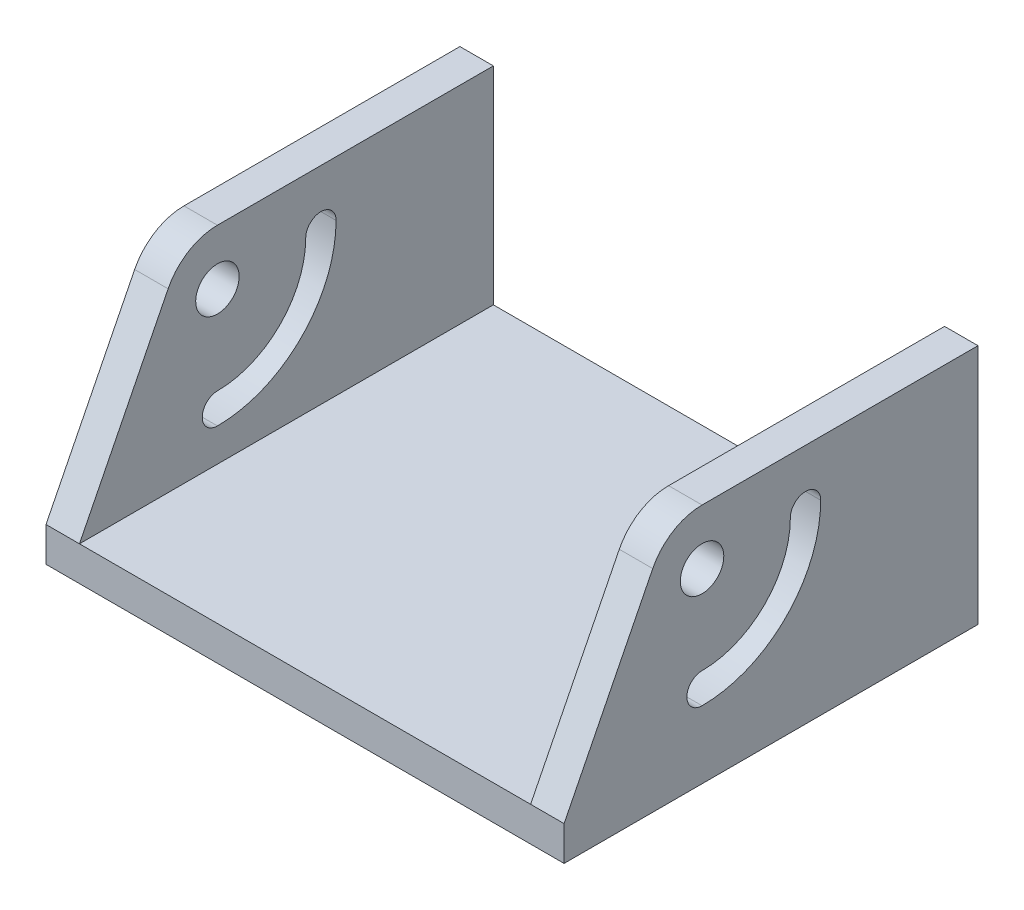
ISO-10303-21;
HEADER;
FILE_DESCRIPTION(('STEP AP214'),'2;1');
FILE_NAME('part.step','',(''),(''),'','','');
FILE_SCHEMA(('AUTOMOTIVE_DESIGN { 1 0 10303 214 1 1 1 1 }'));
ENDSEC;
DATA;
#1=APPLICATION_CONTEXT('core data for automotive mechanical design processes');
#2=APPLICATION_PROTOCOL_DEFINITION('international standard','automotive_design',2000,#1);
#3=PRODUCT_CONTEXT('',#1,'mechanical');
#4=PRODUCT('Part','Part','',(#3));
#5=PRODUCT_RELATED_PRODUCT_CATEGORY('part','',(#4));
#6=PRODUCT_DEFINITION_FORMATION('','',#4);
#7=PRODUCT_DEFINITION_CONTEXT('part definition',#1,'design');
#8=PRODUCT_DEFINITION('design','',#6,#7);
#9=PRODUCT_DEFINITION_SHAPE('','',#8);
#10=(LENGTH_UNIT() NAMED_UNIT(*) SI_UNIT(.MILLI.,.METRE.));
#11=(NAMED_UNIT(*) PLANE_ANGLE_UNIT() SI_UNIT($,.RADIAN.));
#12=(NAMED_UNIT(*) SI_UNIT($,.STERADIAN.) SOLID_ANGLE_UNIT());
#13=UNCERTAINTY_MEASURE_WITH_UNIT(LENGTH_MEASURE(1.E-05),#10,'distance_accuracy_value','');
#14=(GEOMETRIC_REPRESENTATION_CONTEXT(3) GLOBAL_UNCERTAINTY_ASSIGNED_CONTEXT((#13)) GLOBAL_UNIT_ASSIGNED_CONTEXT((#10,
#11,#12)) REPRESENTATION_CONTEXT('',''));
#15=CARTESIAN_POINT('',(0.,0.,0.));
#16=DIRECTION('',(0.,0.,1.));
#17=DIRECTION('',(1.,0.,0.));
#18=AXIS2_PLACEMENT_3D('',#15,#16,#17);
#19=CARTESIAN_POINT('',(-37.55,35.,-30.));
#20=DIRECTION('',(-1.,0.,0.));
#21=DIRECTION('',(0.,-1.,0.));
#22=AXIS2_PLACEMENT_3D('',#19,#20,#21);
#23=PLANE('',#22);
#24=DIRECTION('',(0.,-1.,0.));
#25=VECTOR('',#24,1.);
#26=CARTESIAN_POINT('',(-37.55,35.,30.));
#27=LINE('',#26,#25);
#28=CARTESIAN_POINT('',(-37.55,4.99999999999998,30.));
#29=VERTEX_POINT('',#28);
#30=CARTESIAN_POINT('',(-37.55,0.,30.));
#31=VERTEX_POINT('',#30);
#32=EDGE_CURVE('E330',#29,#31,#27,.T.);
#33=ORIENTED_EDGE('',*,*,#32,.F.);
#34=DIRECTION('',(0.,0.893647202244524,-0.448770183858659));
#35=VECTOR('',#34,1.);
#36=CARTESIAN_POINT('',(-37.55,13.0382399672842,25.9633707586642));
#37=LINE('',#36,#35);
#38=CARTESIAN_POINT('',(-37.55,30.5901614708693,17.1491776179562));
#39=VERTEX_POINT('',#38);
#40=EDGE_CURVE('E280',#29,#39,#37,.T.);
#41=ORIENTED_EDGE('',*,*,#40,.T.);
#42=CARTESIAN_POINT('',(-37.55,27.,9.99999999999999));
#43=DIRECTION('',(-1.,0.,0.));
#44=DIRECTION('',(0.,-1.,0.));
#45=AXIS2_PLACEMENT_3D('',#42,#43,#44);
#46=CIRCLE('',#45,8.);
#47=CARTESIAN_POINT('',(-37.55,35.,10.));
#48=VERTEX_POINT('',#47);
#49=EDGE_CURVE('E273',#48,#39,#46,.F.);
#50=ORIENTED_EDGE('',*,*,#49,.F.);
#51=DIRECTION('',(0.,0.,1.));
#52=VECTOR('',#51,1.);
#53=CARTESIAN_POINT('',(-37.55,35.,-30.));
#54=LINE('',#53,#52);
#55=CARTESIAN_POINT('',(-37.55,35.,-30.));
#56=VERTEX_POINT('',#55);
#57=EDGE_CURVE('E96',#56,#48,#54,.T.);
#58=ORIENTED_EDGE('',*,*,#57,.F.);
#59=DIRECTION('',(0.,-1.,0.));
#60=VECTOR('',#59,1.);
#61=CARTESIAN_POINT('',(-37.55,35.,-30.));
#62=LINE('',#61,#60);
#63=CARTESIAN_POINT('',(-37.55,0.,-30.));
#64=VERTEX_POINT('',#63);
#65=EDGE_CURVE('E341',#56,#64,#62,.T.);
#66=ORIENTED_EDGE('',*,*,#65,.T.);
#67=DIRECTION('',(0.,0.,1.));
#68=VECTOR('',#67,1.);
#69=CARTESIAN_POINT('',(-37.55,0.,-30.));
#70=LINE('',#69,#68);
#71=EDGE_CURVE('E365',#64,#31,#70,.T.);
#72=ORIENTED_EDGE('',*,*,#71,.T.);
#73=EDGE_LOOP('',(#33,#41,#50,#58,#66,#72));
#74=FACE_BOUND('',#73,.T.);
#75=CARTESIAN_POINT('',(-37.55,27.,9.99999999999999));
#76=DIRECTION('',(-1.,0.,0.));
#77=DIRECTION('',(0.,-1.,0.));
#78=AXIS2_PLACEMENT_3D('',#75,#76,#77);
#79=CIRCLE('',#78,17.1999999999999);
#80=CARTESIAN_POINT('',(-37.55,27.,-7.19999999999987));
#81=VERTEX_POINT('',#80);
#82=CARTESIAN_POINT('',(-37.55,9.80000000000011,10.));
#83=VERTEX_POINT('',#82);
#84=EDGE_CURVE('E103',#81,#83,#79,.T.);
#85=ORIENTED_EDGE('',*,*,#84,.F.);
#86=CARTESIAN_POINT('',(-37.55,27.,-5.00000000000002));
#87=DIRECTION('',(-1.,0.,0.));
#88=DIRECTION('',(0.,-1.,0.));
#89=AXIS2_PLACEMENT_3D('',#86,#87,#88);
#90=CIRCLE('',#89,2.19999999999987);
#91=CARTESIAN_POINT('',(-37.55,27.,-2.80000000000014));
#92=VERTEX_POINT('',#91);
#93=EDGE_CURVE('E247',#92,#81,#90,.T.);
#94=ORIENTED_EDGE('',*,*,#93,.F.);
#95=CARTESIAN_POINT('',(-37.55,27.,9.99999999999999));
#96=DIRECTION('',(-1.,0.,0.));
#97=DIRECTION('',(0.,-1.,0.));
#98=AXIS2_PLACEMENT_3D('',#95,#96,#97);
#99=CIRCLE('',#98,12.8000000000001);
#100=CARTESIAN_POINT('',(-37.55,14.1999999999999,9.99999999999999));
#101=VERTEX_POINT('',#100);
#102=EDGE_CURVE('E250',#92,#101,#99,.T.);
#103=ORIENTED_EDGE('',*,*,#102,.T.);
#104=CARTESIAN_POINT('',(-37.55,12.,10.));
#105=DIRECTION('',(-1.,0.,0.));
#106=DIRECTION('',(0.,-1.,0.));
#107=AXIS2_PLACEMENT_3D('',#104,#105,#106);
#108=CIRCLE('',#107,2.19999999999987);
#109=EDGE_CURVE('E256',#101,#83,#108,.F.);
#110=ORIENTED_EDGE('',*,*,#109,.T.);
#111=EDGE_LOOP('',(#85,#94,#103,#110));
#112=FACE_BOUND('',#111,.T.);
#113=CARTESIAN_POINT('',(-37.55,27.,9.99999999999999));
#114=DIRECTION('',(-1.,0.,0.));
#115=DIRECTION('',(0.,-1.,0.));
#116=AXIS2_PLACEMENT_3D('',#113,#114,#115);
#117=CIRCLE('',#116,3.15);
#118=CARTESIAN_POINT('',(-37.55,23.85,9.99999999999999));
#119=VERTEX_POINT('',#118);
#120=EDGE_CURVE('E263',#119,#119,#117,.T.);
#121=ORIENTED_EDGE('',*,*,#120,.F.);
#122=EDGE_LOOP('',(#121));
#123=FACE_BOUND('',#122,.T.);
#124=ADVANCED_FACE('F89',(#74,#112,#123),#23,.T.);
#125=CARTESIAN_POINT('',(-32.7,35.,-30.));
#126=DIRECTION('',(0.,1.,0.));
#127=DIRECTION('',(-1.,0.,0.));
#128=AXIS2_PLACEMENT_3D('',#125,#126,#127);
#129=PLANE('',#128);
#130=ORIENTED_EDGE('',*,*,#57,.T.);
#131=DIRECTION('',(-1.,0.,0.));
#132=VECTOR('',#131,1.);
#133=CARTESIAN_POINT('',(37.55,35.,10.));
#134=LINE('',#133,#132);
#135=CARTESIAN_POINT('',(-32.7,35.,10.));
#136=VERTEX_POINT('',#135);
#137=EDGE_CURVE('E282',#136,#48,#134,.T.);
#138=ORIENTED_EDGE('',*,*,#137,.F.);
#139=DIRECTION('',(0.,0.,1.));
#140=VECTOR('',#139,1.);
#141=CARTESIAN_POINT('',(-32.7,35.,-30.));
#142=LINE('',#141,#140);
#143=CARTESIAN_POINT('',(-32.7,35.,-30.));
#144=VERTEX_POINT('',#143);
#145=EDGE_CURVE('E368',#144,#136,#142,.T.);
#146=ORIENTED_EDGE('',*,*,#145,.F.);
#147=DIRECTION('',(-1.,0.,0.));
#148=VECTOR('',#147,1.);
#149=CARTESIAN_POINT('',(-32.7,35.,-30.));
#150=LINE('',#149,#148);
#151=EDGE_CURVE('E362',#144,#56,#150,.T.);
#152=ORIENTED_EDGE('',*,*,#151,.T.);
#153=EDGE_LOOP('',(#130,#138,#146,#152));
#154=FACE_BOUND('',#153,.T.);
#155=ADVANCED_FACE('F432',(#154),#129,.T.);
#156=CARTESIAN_POINT('',(-32.7,4.99999999999999,-30.));
#157=DIRECTION('',(1.,0.,0.));
#158=DIRECTION('',(0.,0.,-1.));
#159=AXIS2_PLACEMENT_3D('',#156,#157,#158);
#160=PLANE('',#159);
#161=CARTESIAN_POINT('',(-32.7,27.,9.99999999999999));
#162=DIRECTION('',(1.,0.,0.));
#163=DIRECTION('',(0.,0.,-1.));
#164=AXIS2_PLACEMENT_3D('',#161,#162,#163);
#165=CIRCLE('',#164,8.);
#166=CARTESIAN_POINT('',(-32.7,30.5901614708693,17.1491776179562));
#167=VERTEX_POINT('',#166);
#168=EDGE_CURVE('E304',#167,#136,#165,.F.);
#169=ORIENTED_EDGE('',*,*,#168,.F.);
#170=DIRECTION('',(0.,-0.893647202244524,0.448770183858659));
#171=VECTOR('',#170,1.);
#172=CARTESIAN_POINT('',(-32.7,29.0625331553631,17.9163193247679));
#173=LINE('',#172,#171);
#174=CARTESIAN_POINT('',(-32.7,4.99999999999998,30.));
#175=VERTEX_POINT('',#174);
#176=EDGE_CURVE('E299',#167,#175,#173,.T.);
#177=ORIENTED_EDGE('',*,*,#176,.T.);
#178=DIRECTION('',(0.,0.,1.));
#179=VECTOR('',#178,1.);
#180=CARTESIAN_POINT('',(-32.7,4.99999999999999,-30.));
#181=LINE('',#180,#179);
#182=CARTESIAN_POINT('',(-32.7,4.99999999999999,-30.));
#183=VERTEX_POINT('',#182);
#184=EDGE_CURVE('E371',#183,#175,#181,.T.);
#185=ORIENTED_EDGE('',*,*,#184,.F.);
#186=DIRECTION('',(0.,1.,0.));
#187=VECTOR('',#186,1.);
#188=CARTESIAN_POINT('',(-32.7,4.99999999999999,-30.));
#189=LINE('',#188,#187);
#190=EDGE_CURVE('E359',#183,#144,#189,.T.);
#191=ORIENTED_EDGE('',*,*,#190,.T.);
#192=ORIENTED_EDGE('',*,*,#145,.T.);
#193=EDGE_LOOP('',(#169,#177,#185,#191,#192));
#194=FACE_BOUND('',#193,.T.);
#195=CARTESIAN_POINT('',(-32.7,27.,9.99999999999999));
#196=DIRECTION('',(1.,0.,0.));
#197=DIRECTION('',(0.,0.,-1.));
#198=AXIS2_PLACEMENT_3D('',#195,#196,#197);
#199=CIRCLE('',#198,17.1999999999999);
#200=CARTESIAN_POINT('',(-32.7,9.80000000000012,9.99999999999999));
#201=VERTEX_POINT('',#200);
#202=CARTESIAN_POINT('',(-32.7,27.,-7.19999999999987));
#203=VERTEX_POINT('',#202);
#204=EDGE_CURVE('E322',#201,#203,#199,.T.);
#205=ORIENTED_EDGE('',*,*,#204,.F.);
#206=CARTESIAN_POINT('',(-32.7,12.,10.));
#207=DIRECTION('',(1.,0.,0.));
#208=DIRECTION('',(0.,0.,-1.));
#209=AXIS2_PLACEMENT_3D('',#206,#207,#208);
#210=CIRCLE('',#209,2.19999999999987);
#211=CARTESIAN_POINT('',(-32.7,14.1999999999999,9.99999999999999));
#212=VERTEX_POINT('',#211);
#213=EDGE_CURVE('E308',#201,#212,#210,.F.);
#214=ORIENTED_EDGE('',*,*,#213,.T.);
#215=CARTESIAN_POINT('',(-32.7,27.,9.99999999999999));
#216=DIRECTION('',(1.,0.,0.));
#217=DIRECTION('',(0.,0.,-1.));
#218=AXIS2_PLACEMENT_3D('',#215,#216,#217);
#219=CIRCLE('',#218,12.8000000000001);
#220=CARTESIAN_POINT('',(-32.7,27.,-2.80000000000014));
#221=VERTEX_POINT('',#220);
#222=EDGE_CURVE('E314',#212,#221,#219,.T.);
#223=ORIENTED_EDGE('',*,*,#222,.T.);
#224=CARTESIAN_POINT('',(-32.7,27.,-5.00000000000002));
#225=DIRECTION('',(1.,0.,0.));
#226=DIRECTION('',(0.,0.,-1.));
#227=AXIS2_PLACEMENT_3D('',#224,#225,#226);
#228=CIRCLE('',#227,2.19999999999987);
#229=EDGE_CURVE('E319',#203,#221,#228,.T.);
#230=ORIENTED_EDGE('',*,*,#229,.F.);
#231=EDGE_LOOP('',(#205,#214,#223,#230));
#232=FACE_BOUND('',#231,.T.);
#233=CARTESIAN_POINT('',(-32.7,27.,9.99999999999999));
#234=DIRECTION('',(1.,0.,0.));
#235=DIRECTION('',(0.,0.,-1.));
#236=AXIS2_PLACEMENT_3D('',#233,#234,#235);
#237=CIRCLE('',#236,3.15);
#238=CARTESIAN_POINT('',(-32.7,27.,6.85));
#239=VERTEX_POINT('',#238);
#240=EDGE_CURVE('E327',#239,#239,#237,.T.);
#241=ORIENTED_EDGE('',*,*,#240,.F.);
#242=EDGE_LOOP('',(#241));
#243=FACE_BOUND('',#242,.T.);
#244=ADVANCED_FACE('F425',(#194,#232,#243),#160,.T.);
#245=CARTESIAN_POINT('',(32.7,35.,-30.));
#246=DIRECTION('',(-1.,0.,0.));
#247=DIRECTION('',(0.,-1.,0.));
#248=AXIS2_PLACEMENT_3D('',#245,#246,#247);
#249=PLANE('',#248);
#250=DIRECTION('',(0.,0.,1.));
#251=VECTOR('',#250,1.);
#252=CARTESIAN_POINT('',(32.7,5.,-30.));
#253=LINE('',#252,#251);
#254=CARTESIAN_POINT('',(32.7,5.,-30.));
#255=VERTEX_POINT('',#254);
#256=CARTESIAN_POINT('',(32.7,5.,30.));
#257=VERTEX_POINT('',#256);
#258=EDGE_CURVE('E374',#255,#257,#253,.T.);
#259=ORIENTED_EDGE('',*,*,#258,.T.);
#260=DIRECTION('',(0.,0.893647202244524,-0.448770183858659));
#261=VECTOR('',#260,1.);
#262=CARTESIAN_POINT('',(32.7,53.020692817747,5.8850527470864));
#263=LINE('',#262,#261);
#264=CARTESIAN_POINT('',(32.7,30.5901614708693,17.1491776179562));
#265=VERTEX_POINT('',#264);
#266=EDGE_CURVE('E290',#257,#265,#263,.T.);
#267=ORIENTED_EDGE('',*,*,#266,.T.);
#268=CARTESIAN_POINT('',(32.7,27.,9.99999999999999));
#269=DIRECTION('',(-1.,0.,0.));
#270=DIRECTION('',(0.,-1.,0.));
#271=AXIS2_PLACEMENT_3D('',#268,#269,#270);
#272=CIRCLE('',#271,8.);
#273=CARTESIAN_POINT('',(32.7,35.,10.));
#274=VERTEX_POINT('',#273);
#275=EDGE_CURVE('E302',#274,#265,#272,.F.);
#276=ORIENTED_EDGE('',*,*,#275,.F.);
#277=DIRECTION('',(0.,0.,1.));
#278=VECTOR('',#277,1.);
#279=CARTESIAN_POINT('',(32.7,35.,-30.));
#280=LINE('',#279,#278);
#281=CARTESIAN_POINT('',(32.7,35.,-30.));
#282=VERTEX_POINT('',#281);
#283=EDGE_CURVE('E377',#282,#274,#280,.T.);
#284=ORIENTED_EDGE('',*,*,#283,.F.);
#285=DIRECTION('',(0.,-1.,0.));
#286=VECTOR('',#285,1.);
#287=CARTESIAN_POINT('',(32.7,35.,-30.));
#288=LINE('',#287,#286);
#289=EDGE_CURVE('E353',#282,#255,#288,.T.);
#290=ORIENTED_EDGE('',*,*,#289,.T.);
#291=EDGE_LOOP('',(#259,#267,#276,#284,#290));
#292=FACE_BOUND('',#291,.T.);
#293=CARTESIAN_POINT('',(32.7,27.,9.99999999999999));
#294=DIRECTION('',(-1.,0.,0.));
#295=DIRECTION('',(0.,-1.,0.));
#296=AXIS2_PLACEMENT_3D('',#293,#294,#295);
#297=CIRCLE('',#296,17.1999999999999);
#298=CARTESIAN_POINT('',(32.7,27.0000000000001,-7.19999999999987));
#299=VERTEX_POINT('',#298);
#300=CARTESIAN_POINT('',(32.7,9.80000000000013,10.));
#301=VERTEX_POINT('',#300);
#302=EDGE_CURVE('E239',#299,#301,#297,.T.);
#303=ORIENTED_EDGE('',*,*,#302,.F.);
#304=CARTESIAN_POINT('',(32.7,27.,-5.00000000000002));
#305=DIRECTION('',(-1.,0.,0.));
#306=DIRECTION('',(0.,-1.,0.));
#307=AXIS2_PLACEMENT_3D('',#304,#305,#306);
#308=CIRCLE('',#307,2.19999999999987);
#309=CARTESIAN_POINT('',(32.7,27.,-2.80000000000014));
#310=VERTEX_POINT('',#309);
#311=EDGE_CURVE('E317',#310,#299,#308,.T.);
#312=ORIENTED_EDGE('',*,*,#311,.F.);
#313=CARTESIAN_POINT('',(32.7,27.,9.99999999999999));
#314=DIRECTION('',(-1.,0.,0.));
#315=DIRECTION('',(0.,-1.,0.));
#316=AXIS2_PLACEMENT_3D('',#313,#314,#315);
#317=CIRCLE('',#316,12.8000000000001);
#318=CARTESIAN_POINT('',(32.7,14.1999999999999,9.99999999999999));
#319=VERTEX_POINT('',#318);
#320=EDGE_CURVE('E311',#310,#319,#317,.T.);
#321=ORIENTED_EDGE('',*,*,#320,.T.);
#322=CARTESIAN_POINT('',(32.7,12.,10.));
#323=DIRECTION('',(-1.,0.,0.));
#324=DIRECTION('',(0.,-1.,0.));
#325=AXIS2_PLACEMENT_3D('',#322,#323,#324);
#326=CIRCLE('',#325,2.19999999999987);
#327=EDGE_CURVE('E306',#319,#301,#326,.F.);
#328=ORIENTED_EDGE('',*,*,#327,.T.);
#329=EDGE_LOOP('',(#303,#312,#321,#328));
#330=FACE_BOUND('',#329,.T.);
#331=CARTESIAN_POINT('',(32.7,27.,9.99999999999999));
#332=DIRECTION('',(-1.,0.,0.));
#333=DIRECTION('',(0.,-1.,0.));
#334=AXIS2_PLACEMENT_3D('',#331,#332,#333);
#335=CIRCLE('',#334,3.15);
#336=CARTESIAN_POINT('',(32.7,23.85,9.99999999999999));
#337=VERTEX_POINT('',#336);
#338=EDGE_CURVE('E324',#337,#337,#335,.T.);
#339=ORIENTED_EDGE('',*,*,#338,.F.);
#340=EDGE_LOOP('',(#339));
#341=FACE_BOUND('',#340,.T.);
#342=ADVANCED_FACE('F407',(#292,#330,#341),#249,.T.);
#343=CARTESIAN_POINT('',(37.55,35.,-30.));
#344=DIRECTION('',(0.,1.,0.));
#345=DIRECTION('',(-1.,0.,0.));
#346=AXIS2_PLACEMENT_3D('',#343,#344,#345);
#347=PLANE('',#346);
#348=ORIENTED_EDGE('',*,*,#283,.T.);
#349=CARTESIAN_POINT('',(37.55,35.,10.));
#350=VERTEX_POINT('',#349);
#351=EDGE_CURVE('E295',#350,#274,#134,.T.);
#352=ORIENTED_EDGE('',*,*,#351,.F.);
#353=DIRECTION('',(0.,0.,1.));
#354=VECTOR('',#353,1.);
#355=CARTESIAN_POINT('',(37.55,35.,-30.));
#356=LINE('',#355,#354);
#357=CARTESIAN_POINT('',(37.55,35.,-30.));
#358=VERTEX_POINT('',#357);
#359=EDGE_CURVE('E380',#358,#350,#356,.T.);
#360=ORIENTED_EDGE('',*,*,#359,.F.);
#361=DIRECTION('',(-1.,0.,0.));
#362=VECTOR('',#361,1.);
#363=CARTESIAN_POINT('',(37.55,35.,-30.));
#364=LINE('',#363,#362);
#365=EDGE_CURVE('E350',#358,#282,#364,.T.);
#366=ORIENTED_EDGE('',*,*,#365,.T.);
#367=EDGE_LOOP('',(#348,#352,#360,#366));
#368=FACE_BOUND('',#367,.T.);
#369=ADVANCED_FACE('F411',(#368),#347,.T.);
#370=CARTESIAN_POINT('',(37.55,0.,-30.));
#371=DIRECTION('',(1.,0.,0.));
#372=DIRECTION('',(0.,1.,0.));
#373=AXIS2_PLACEMENT_3D('',#370,#371,#372);
#374=PLANE('',#373);
#375=CARTESIAN_POINT('',(37.55,27.,9.99999999999999));
#376=DIRECTION('',(-1.,0.,0.));
#377=DIRECTION('',(0.,-1.,0.));
#378=AXIS2_PLACEMENT_3D('',#375,#376,#377);
#379=CIRCLE('',#378,8.);
#380=CARTESIAN_POINT('',(37.55,30.5901614708693,17.1491776179562));
#381=VERTEX_POINT('',#380);
#382=EDGE_CURVE('E276',#350,#381,#379,.F.);
#383=ORIENTED_EDGE('',*,*,#382,.T.);
#384=DIRECTION('',(0.,0.893647202244524,-0.448770183858659));
#385=VECTOR('',#384,1.);
#386=CARTESIAN_POINT('',(37.55,13.0382399672842,25.9633707586642));
#387=LINE('',#386,#385);
#388=CARTESIAN_POINT('',(37.55,4.99999999999999,30.));
#389=VERTEX_POINT('',#388);
#390=EDGE_CURVE('E279',#389,#381,#387,.T.);
#391=ORIENTED_EDGE('',*,*,#390,.F.);
#392=DIRECTION('',(0.,1.,0.));
#393=VECTOR('',#392,1.);
#394=CARTESIAN_POINT('',(37.55,0.,30.));
#395=LINE('',#394,#393);
#396=CARTESIAN_POINT('',(37.55,0.,30.));
#397=VERTEX_POINT('',#396);
#398=EDGE_CURVE('E335',#397,#389,#395,.T.);
#399=ORIENTED_EDGE('',*,*,#398,.F.);
#400=DIRECTION('',(0.,0.,1.));
#401=VECTOR('',#400,1.);
#402=CARTESIAN_POINT('',(37.55,0.,-30.));
#403=LINE('',#402,#401);
#404=CARTESIAN_POINT('',(37.55,0.,-30.));
#405=VERTEX_POINT('',#404);
#406=EDGE_CURVE('E383',#405,#397,#403,.T.);
#407=ORIENTED_EDGE('',*,*,#406,.F.);
#408=DIRECTION('',(0.,1.,0.));
#409=VECTOR('',#408,1.);
#410=CARTESIAN_POINT('',(37.55,0.,-30.));
#411=LINE('',#410,#409);
#412=EDGE_CURVE('E347',#405,#358,#411,.T.);
#413=ORIENTED_EDGE('',*,*,#412,.T.);
#414=ORIENTED_EDGE('',*,*,#359,.T.);
#415=EDGE_LOOP('',(#383,#391,#399,#407,#413,#414));
#416=FACE_BOUND('',#415,.T.);
#417=CARTESIAN_POINT('',(37.55,27.,9.99999999999999));
#418=DIRECTION('',(-1.,0.,0.));
#419=DIRECTION('',(0.,-1.,0.));
#420=AXIS2_PLACEMENT_3D('',#417,#418,#419);
#421=CIRCLE('',#420,17.1999999999999);
#422=CARTESIAN_POINT('',(37.55,27.0000000000001,-7.19999999999987));
#423=VERTEX_POINT('',#422);
#424=CARTESIAN_POINT('',(37.55,9.80000000000013,9.99999999999999));
#425=VERTEX_POINT('',#424);
#426=EDGE_CURVE('E231',#423,#425,#421,.T.);
#427=ORIENTED_EDGE('',*,*,#426,.T.);
#428=CARTESIAN_POINT('',(37.55,12.,10.));
#429=DIRECTION('',(-1.,0.,0.));
#430=DIRECTION('',(0.,-1.,0.));
#431=AXIS2_PLACEMENT_3D('',#428,#429,#430);
#432=CIRCLE('',#431,2.19999999999987);
#433=CARTESIAN_POINT('',(37.55,14.1999999999999,10.));
#434=VERTEX_POINT('',#433);
#435=EDGE_CURVE('E219',#434,#425,#432,.F.);
#436=ORIENTED_EDGE('',*,*,#435,.F.);
#437=CARTESIAN_POINT('',(37.55,27.,9.99999999999999));
#438=DIRECTION('',(-1.,0.,0.));
#439=DIRECTION('',(0.,-1.,0.));
#440=AXIS2_PLACEMENT_3D('',#437,#438,#439);
#441=CIRCLE('',#440,12.8000000000001);
#442=CARTESIAN_POINT('',(37.55,27.,-2.80000000000014));
#443=VERTEX_POINT('',#442);
#444=EDGE_CURVE('E230',#443,#434,#441,.T.);
#445=ORIENTED_EDGE('',*,*,#444,.F.);
#446=CARTESIAN_POINT('',(37.55,27.,-5.00000000000002));
#447=DIRECTION('',(-1.,0.,0.));
#448=DIRECTION('',(0.,-1.,0.));
#449=AXIS2_PLACEMENT_3D('',#446,#447,#448);
#450=CIRCLE('',#449,2.19999999999987);
#451=EDGE_CURVE('E246',#443,#423,#450,.T.);
#452=ORIENTED_EDGE('',*,*,#451,.T.);
#453=EDGE_LOOP('',(#427,#436,#445,#452));
#454=FACE_BOUND('',#453,.T.);
#455=CARTESIAN_POINT('',(37.55,27.,9.99999999999999));
#456=DIRECTION('',(-1.,0.,0.));
#457=DIRECTION('',(0.,-1.,0.));
#458=AXIS2_PLACEMENT_3D('',#455,#456,#457);
#459=CIRCLE('',#458,3.15);
#460=CARTESIAN_POINT('',(37.55,23.85,9.99999999999999));
#461=VERTEX_POINT('',#460);
#462=EDGE_CURVE('E270',#461,#461,#459,.T.);
#463=ORIENTED_EDGE('',*,*,#462,.T.);
#464=EDGE_LOOP('',(#463));
#465=FACE_BOUND('',#464,.T.);
#466=ADVANCED_FACE('F243',(#416,#454,#465),#374,.T.);
#467=CARTESIAN_POINT('',(0.,0.,30.));
#468=DIRECTION('',(0.,0.,1.));
#469=DIRECTION('',(1.,0.,0.));
#470=AXIS2_PLACEMENT_3D('',#467,#468,#469);
#471=PLANE('',#470);
#472=ORIENTED_EDGE('',*,*,#398,.T.);
#473=DIRECTION('',(-1.,0.,0.));
#474=VECTOR('',#473,1.);
#475=CARTESIAN_POINT('',(37.55,4.99999999999999,30.));
#476=LINE('',#475,#474);
#477=EDGE_CURVE('E287',#389,#257,#476,.T.);
#478=ORIENTED_EDGE('',*,*,#477,.T.);
#479=DIRECTION('',(-1.,0.,0.));
#480=VECTOR('',#479,1.);
#481=CARTESIAN_POINT('',(32.7,5.,30.));
#482=LINE('',#481,#480);
#483=EDGE_CURVE('E338',#257,#175,#482,.T.);
#484=ORIENTED_EDGE('',*,*,#483,.T.);
#485=DIRECTION('',(-1.,0.,0.));
#486=VECTOR('',#485,1.);
#487=CARTESIAN_POINT('',(0.,5.,30.));
#488=LINE('',#487,#486);
#489=EDGE_CURVE('E12',#175,#29,#488,.T.);
#490=ORIENTED_EDGE('',*,*,#489,.T.);
#491=ORIENTED_EDGE('',*,*,#32,.T.);
#492=DIRECTION('',(1.,0.,0.));
#493=VECTOR('',#492,1.);
#494=CARTESIAN_POINT('',(-37.55,0.,30.));
#495=LINE('',#494,#493);
#496=EDGE_CURVE('E332',#31,#397,#495,.T.);
#497=ORIENTED_EDGE('',*,*,#496,.T.);
#498=EDGE_LOOP('',(#472,#478,#484,#490,#491,#497));
#499=FACE_BOUND('',#498,.T.);
#500=ADVANCED_FACE('F395',(#499),#471,.T.);
#501=CARTESIAN_POINT('',(32.7,5.,-30.));
#502=DIRECTION('',(0.,1.,0.));
#503=DIRECTION('',(-1.,0.,0.));
#504=AXIS2_PLACEMENT_3D('',#501,#502,#503);
#505=PLANE('',#504);
#506=ORIENTED_EDGE('',*,*,#184,.T.);
#507=ORIENTED_EDGE('',*,*,#483,.F.);
#508=ORIENTED_EDGE('',*,*,#258,.F.);
#509=DIRECTION('',(-1.,0.,0.));
#510=VECTOR('',#509,1.);
#511=CARTESIAN_POINT('',(32.7,5.,-30.));
#512=LINE('',#511,#510);
#513=EDGE_CURVE('E356',#255,#183,#512,.T.);
#514=ORIENTED_EDGE('',*,*,#513,.T.);
#515=EDGE_LOOP('',(#506,#507,#508,#514));
#516=FACE_BOUND('',#515,.T.);
#517=ADVANCED_FACE('F419',(#516),#505,.T.);
#518=CARTESIAN_POINT('',(-37.55,0.,-30.));
#519=DIRECTION('',(0.,-1.,0.));
#520=DIRECTION('',(1.,0.,0.));
#521=AXIS2_PLACEMENT_3D('',#518,#519,#520);
#522=PLANE('',#521);
#523=ORIENTED_EDGE('',*,*,#406,.T.);
#524=ORIENTED_EDGE('',*,*,#496,.F.);
#525=ORIENTED_EDGE('',*,*,#71,.F.);
#526=DIRECTION('',(1.,0.,0.));
#527=VECTOR('',#526,1.);
#528=CARTESIAN_POINT('',(-37.55,0.,-30.));
#529=LINE('',#528,#527);
#530=EDGE_CURVE('E344',#64,#405,#529,.T.);
#531=ORIENTED_EDGE('',*,*,#530,.T.);
#532=EDGE_LOOP('',(#523,#524,#525,#531));
#533=FACE_BOUND('',#532,.T.);
#534=ADVANCED_FACE('F392',(#533),#522,.T.);
#535=CARTESIAN_POINT('',(0.,0.,-30.));
#536=DIRECTION('',(0.,0.,1.));
#537=DIRECTION('',(1.,0.,0.));
#538=AXIS2_PLACEMENT_3D('',#535,#536,#537);
#539=PLANE('',#538);
#540=ORIENTED_EDGE('',*,*,#65,.F.);
#541=ORIENTED_EDGE('',*,*,#151,.F.);
#542=ORIENTED_EDGE('',*,*,#190,.F.);
#543=ORIENTED_EDGE('',*,*,#513,.F.);
#544=ORIENTED_EDGE('',*,*,#289,.F.);
#545=ORIENTED_EDGE('',*,*,#365,.F.);
#546=ORIENTED_EDGE('',*,*,#412,.F.);
#547=ORIENTED_EDGE('',*,*,#530,.F.);
#548=EDGE_LOOP('',(#540,#541,#542,#543,#544,#545,#546,#547));
#549=FACE_BOUND('',#548,.T.);
#550=ADVANCED_FACE('F414',(#549),#539,.F.);
#551=CARTESIAN_POINT('',(37.55,13.0382399672842,25.9633707586642));
#552=DIRECTION('',(0.,0.448770183858659,0.893647202244524));
#553=DIRECTION('',(0.,-0.893647202244524,0.448770183858659));
#554=AXIS2_PLACEMENT_3D('',#551,#552,#553);
#555=PLANE('',#554);
#556=DIRECTION('',(-1.,0.,0.));
#557=VECTOR('',#556,1.);
#558=CARTESIAN_POINT('',(37.55,30.5901614708693,17.1491776179562));
#559=LINE('',#558,#557);
#560=EDGE_CURVE('E294',#167,#39,#559,.T.);
#561=ORIENTED_EDGE('',*,*,#560,.T.);
#562=ORIENTED_EDGE('',*,*,#40,.F.);
#563=ORIENTED_EDGE('',*,*,#489,.F.);
#564=ORIENTED_EDGE('',*,*,#176,.F.);
#565=EDGE_LOOP('',(#561,#562,#563,#564));
#566=FACE_BOUND('',#565,.T.);
#567=ADVANCED_FACE('F421',(#566),#555,.T.);
#568=CARTESIAN_POINT('',(37.55,27.,9.99999999999999));
#569=DIRECTION('',(-1.,0.,0.));
#570=DIRECTION('',(0.,-1.,0.));
#571=AXIS2_PLACEMENT_3D('',#568,#569,#570);
#572=CYLINDRICAL_SURFACE('',#571,8.);
#573=ORIENTED_EDGE('',*,*,#168,.T.);
#574=ORIENTED_EDGE('',*,*,#137,.T.);
#575=ORIENTED_EDGE('',*,*,#49,.T.);
#576=ORIENTED_EDGE('',*,*,#560,.F.);
#577=EDGE_LOOP('',(#573,#574,#575,#576));
#578=FACE_BOUND('',#577,.T.);
#579=ADVANCED_FACE('F429',(#578),#572,.T.);
#580=ORIENTED_EDGE('',*,*,#477,.F.);
#581=ORIENTED_EDGE('',*,*,#390,.T.);
#582=EDGE_CURVE('E291',#381,#265,#559,.T.);
#583=ORIENTED_EDGE('',*,*,#582,.T.);
#584=ORIENTED_EDGE('',*,*,#266,.F.);
#585=EDGE_LOOP('',(#580,#581,#583,#584));
#586=FACE_BOUND('',#585,.T.);
#587=ADVANCED_FACE('F401',(#586),#555,.T.);
#588=ORIENTED_EDGE('',*,*,#275,.T.);
#589=ORIENTED_EDGE('',*,*,#582,.F.);
#590=ORIENTED_EDGE('',*,*,#382,.F.);
#591=ORIENTED_EDGE('',*,*,#351,.T.);
#592=EDGE_LOOP('',(#588,#589,#590,#591));
#593=FACE_BOUND('',#592,.T.);
#594=ADVANCED_FACE('F403',(#593),#572,.T.);
#595=CARTESIAN_POINT('',(37.55,12.,10.));
#596=DIRECTION('',(-1.,0.,0.));
#597=DIRECTION('',(0.,-1.,0.));
#598=AXIS2_PLACEMENT_3D('',#595,#596,#597);
#599=CYLINDRICAL_SURFACE('',#598,2.19999999999987);
#600=DIRECTION('',(-1.,0.,0.));
#601=VECTOR('',#600,1.);
#602=CARTESIAN_POINT('',(37.55,14.1999999999999,9.99999999999999));
#603=LINE('',#602,#601);
#604=EDGE_CURVE('E225',#434,#319,#603,.T.);
#605=ORIENTED_EDGE('',*,*,#604,.F.);
#606=ORIENTED_EDGE('',*,*,#435,.T.);
#607=DIRECTION('',(-1.,0.,0.));
#608=VECTOR('',#607,1.);
#609=CARTESIAN_POINT('',(37.55,9.80000000000013,9.99999999999999));
#610=LINE('',#609,#608);
#611=EDGE_CURVE('E222',#425,#301,#610,.T.);
#612=ORIENTED_EDGE('',*,*,#611,.T.);
#613=ORIENTED_EDGE('',*,*,#327,.F.);
#614=EDGE_LOOP('',(#605,#606,#612,#613));
#615=FACE_BOUND('',#614,.T.);
#616=ADVANCED_FACE('F221',(#615),#599,.F.);
#617=CARTESIAN_POINT('',(37.55,27.,9.99999999999999));
#618=DIRECTION('',(-1.,0.,0.));
#619=DIRECTION('',(0.,-1.,0.));
#620=AXIS2_PLACEMENT_3D('',#617,#618,#619);
#621=CYLINDRICAL_SURFACE('',#620,12.8000000000001);
#622=DIRECTION('',(-1.,0.,0.));
#623=VECTOR('',#622,1.);
#624=CARTESIAN_POINT('',(37.55,27.,-2.80000000000014));
#625=LINE('',#624,#623);
#626=EDGE_CURVE('E265',#443,#310,#625,.T.);
#627=ORIENTED_EDGE('',*,*,#626,.F.);
#628=ORIENTED_EDGE('',*,*,#444,.T.);
#629=ORIENTED_EDGE('',*,*,#604,.T.);
#630=ORIENTED_EDGE('',*,*,#320,.F.);
#631=EDGE_LOOP('',(#627,#628,#629,#630));
#632=FACE_BOUND('',#631,.T.);
#633=ADVANCED_FACE('F471',(#632),#621,.T.);
#634=CARTESIAN_POINT('',(37.55,27.,-5.00000000000002));
#635=DIRECTION('',(-1.,0.,0.));
#636=DIRECTION('',(0.,-1.,0.));
#637=AXIS2_PLACEMENT_3D('',#634,#635,#636);
#638=CYLINDRICAL_SURFACE('',#637,2.19999999999987);
#639=ORIENTED_EDGE('',*,*,#311,.T.);
#640=DIRECTION('',(-1.,0.,0.));
#641=VECTOR('',#640,1.);
#642=CARTESIAN_POINT('',(37.55,27.0000000000001,-7.19999999999987));
#643=LINE('',#642,#641);
#644=EDGE_CURVE('E261',#423,#299,#643,.T.);
#645=ORIENTED_EDGE('',*,*,#644,.F.);
#646=ORIENTED_EDGE('',*,*,#451,.F.);
#647=ORIENTED_EDGE('',*,*,#626,.T.);
#648=EDGE_LOOP('',(#639,#645,#646,#647));
#649=FACE_BOUND('',#648,.T.);
#650=ADVANCED_FACE('F518',(#649),#638,.F.);
#651=CARTESIAN_POINT('',(37.55,27.,9.99999999999999));
#652=DIRECTION('',(-1.,0.,0.));
#653=DIRECTION('',(0.,-1.,0.));
#654=AXIS2_PLACEMENT_3D('',#651,#652,#653);
#655=CYLINDRICAL_SURFACE('',#654,17.1999999999999);
#656=ORIENTED_EDGE('',*,*,#302,.T.);
#657=ORIENTED_EDGE('',*,*,#611,.F.);
#658=ORIENTED_EDGE('',*,*,#426,.F.);
#659=ORIENTED_EDGE('',*,*,#644,.T.);
#660=EDGE_LOOP('',(#656,#657,#658,#659));
#661=FACE_BOUND('',#660,.T.);
#662=ADVANCED_FACE('F235',(#661),#655,.F.);
#663=CARTESIAN_POINT('',(37.55,27.,9.99999999999999));
#664=DIRECTION('',(-1.,0.,0.));
#665=DIRECTION('',(0.,-1.,0.));
#666=AXIS2_PLACEMENT_3D('',#663,#664,#665);
#667=CYLINDRICAL_SURFACE('',#666,3.15);
#668=ORIENTED_EDGE('',*,*,#338,.T.);
#669=EDGE_LOOP('',(#668));
#670=FACE_BOUND('',#669,.T.);
#671=ORIENTED_EDGE('',*,*,#462,.F.);
#672=EDGE_LOOP('',(#671));
#673=FACE_BOUND('',#672,.T.);
#674=ADVANCED_FACE('F539',(#670,#673),#667,.F.);
#675=ORIENTED_EDGE('',*,*,#204,.T.);
#676=EDGE_CURVE('E264',#203,#81,#643,.T.);
#677=ORIENTED_EDGE('',*,*,#676,.T.);
#678=ORIENTED_EDGE('',*,*,#84,.T.);
#679=EDGE_CURVE('E241',#201,#83,#610,.T.);
#680=ORIENTED_EDGE('',*,*,#679,.F.);
#681=EDGE_LOOP('',(#675,#677,#678,#680));
#682=FACE_BOUND('',#681,.T.);
#683=ADVANCED_FACE('F541',(#682),#655,.F.);
#684=ORIENTED_EDGE('',*,*,#229,.T.);
#685=EDGE_CURVE('E268',#221,#92,#625,.T.);
#686=ORIENTED_EDGE('',*,*,#685,.T.);
#687=ORIENTED_EDGE('',*,*,#93,.T.);
#688=ORIENTED_EDGE('',*,*,#676,.F.);
#689=EDGE_LOOP('',(#684,#686,#687,#688));
#690=FACE_BOUND('',#689,.T.);
#691=ADVANCED_FACE('F531',(#690),#638,.F.);
#692=EDGE_CURVE('E111',#212,#101,#603,.T.);
#693=ORIENTED_EDGE('',*,*,#692,.T.);
#694=ORIENTED_EDGE('',*,*,#102,.F.);
#695=ORIENTED_EDGE('',*,*,#685,.F.);
#696=ORIENTED_EDGE('',*,*,#222,.F.);
#697=EDGE_LOOP('',(#693,#694,#695,#696));
#698=FACE_BOUND('',#697,.T.);
#699=ADVANCED_FACE('F521',(#698),#621,.T.);
#700=ORIENTED_EDGE('',*,*,#679,.T.);
#701=ORIENTED_EDGE('',*,*,#109,.F.);
#702=ORIENTED_EDGE('',*,*,#692,.F.);
#703=ORIENTED_EDGE('',*,*,#213,.F.);
#704=EDGE_LOOP('',(#700,#701,#702,#703));
#705=FACE_BOUND('',#704,.T.);
#706=ADVANCED_FACE('F473',(#705),#599,.F.);
#707=ORIENTED_EDGE('',*,*,#240,.T.);
#708=EDGE_LOOP('',(#707));
#709=FACE_BOUND('',#708,.T.);
#710=ORIENTED_EDGE('',*,*,#120,.T.);
#711=EDGE_LOOP('',(#710));
#712=FACE_BOUND('',#711,.T.);
#713=ADVANCED_FACE('F550',(#709,#712),#667,.F.);
#714=CLOSED_SHELL('',(#124,#155,#244,#342,#369,#466,#500,#517,#534,#550,#567,#579,#587,#594,
#616,#633,#650,#662,#674,#683,#691,#699,#706,#713));
#715=MANIFOLD_SOLID_BREP('B2',#714);
#716=ADVANCED_BREP_SHAPE_REPRESENTATION('',(#18,#715),#14);
#717=SHAPE_DEFINITION_REPRESENTATION(#9,#716);
ENDSEC;
END-ISO-10303-21;
